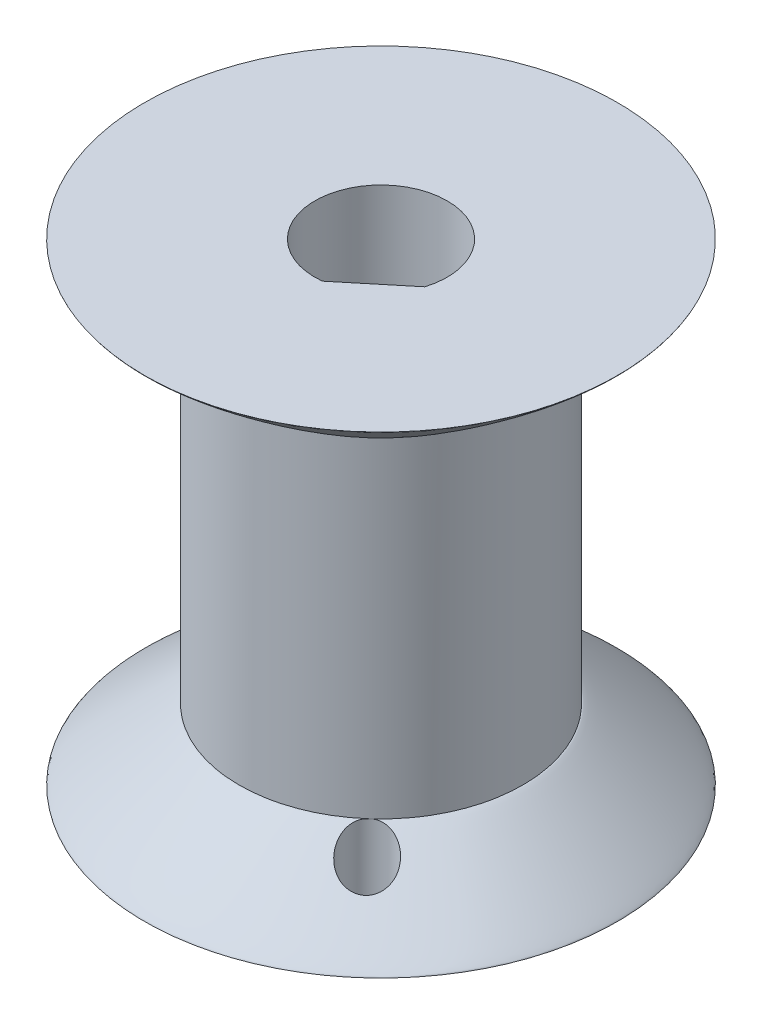
ISO-10303-21;
HEADER;
FILE_DESCRIPTION(('STEP AP214'),'2;1');
FILE_NAME('part.step','',(''),(''),'','','');
FILE_SCHEMA(('AUTOMOTIVE_DESIGN { 1 0 10303 214 1 1 1 1 }'));
ENDSEC;
DATA;
#1=APPLICATION_CONTEXT('core data for automotive mechanical design processes');
#2=APPLICATION_PROTOCOL_DEFINITION('international standard','automotive_design',2000,#1);
#3=PRODUCT_CONTEXT('',#1,'mechanical');
#4=PRODUCT('Part','Part','',(#3));
#5=PRODUCT_RELATED_PRODUCT_CATEGORY('part','',(#4));
#6=PRODUCT_DEFINITION_FORMATION('','',#4);
#7=PRODUCT_DEFINITION_CONTEXT('part definition',#1,'design');
#8=PRODUCT_DEFINITION('design','',#6,#7);
#9=PRODUCT_DEFINITION_SHAPE('','',#8);
#10=(LENGTH_UNIT() NAMED_UNIT(*) SI_UNIT(.MILLI.,.METRE.));
#11=(NAMED_UNIT(*) PLANE_ANGLE_UNIT() SI_UNIT($,.RADIAN.));
#12=(NAMED_UNIT(*) SI_UNIT($,.STERADIAN.) SOLID_ANGLE_UNIT());
#13=UNCERTAINTY_MEASURE_WITH_UNIT(LENGTH_MEASURE(1.E-05),#10,'distance_accuracy_value','');
#14=(GEOMETRIC_REPRESENTATION_CONTEXT(3) GLOBAL_UNCERTAINTY_ASSIGNED_CONTEXT((#13)) GLOBAL_UNIT_ASSIGNED_CONTEXT((#10,
#11,#12)) REPRESENTATION_CONTEXT('',''));
#15=CARTESIAN_POINT('',(0.,0.,0.));
#16=DIRECTION('',(0.,0.,1.));
#17=DIRECTION('',(1.,0.,0.));
#18=AXIS2_PLACEMENT_3D('',#15,#16,#17);
#19=CARTESIAN_POINT('',(0.,20.,0.));
#20=DIRECTION('',(0.,-1.,0.));
#21=DIRECTION('',(0.,0.,-1.));
#22=AXIS2_PLACEMENT_3D('',#19,#20,#21);
#23=CYLINDRICAL_SURFACE('',#22,6.);
#24=CARTESIAN_POINT('',(0.,3.,-6.));
#25=CARTESIAN_POINT('',(0.78539815944648,3.,-6.00000000000033));
#26=CARTESIAN_POINT('',(1.57048730980716,3.,-5.84383605849674));
#27=CARTESIAN_POINT('',(3.02171387857392,3.,-5.2427183316387));
#28=CARTESIAN_POINT('',(3.6872803226441,3.00000000000016,-4.79800105159414));
#29=CARTESIAN_POINT('',(4.79800105159447,2.99999999999984,-3.68728032264443));
#30=CARTESIAN_POINT('',(5.24271833163759,2.99999999999984,-3.02171387857378));
#31=CARTESIAN_POINT('',(5.84383605849785,3.00000000000016,-1.5704873098073));
#32=CARTESIAN_POINT('',(6.00000000000033,3.00000000000016,-0.785398159445174));
#33=CARTESIAN_POINT('',(5.99999999999967,2.99999999999984,0.785398159445173));
#34=CARTESIAN_POINT('',(5.84383605849752,3.00000000000016,1.57048730980697));
#35=CARTESIAN_POINT('',(5.24271833163792,2.99999999999984,3.02171387857411));
#36=CARTESIAN_POINT('',(4.7980010515945,3.,3.68728032264408));
#37=CARTESIAN_POINT('',(3.68728032264407,3.,4.7980010515945));
#38=CARTESIAN_POINT('',(3.0217138785739,3.,5.24271833163818));
#39=CARTESIAN_POINT('',(1.57048730980719,3.,5.84383605849725));
#40=CARTESIAN_POINT('',(0.785398159445174,3.,6.));
#41=CARTESIAN_POINT('',(-0.785398159445173,3.,6.));
#42=CARTESIAN_POINT('',(-1.57048730980685,3.00000000000033,5.84383605849726));
#43=CARTESIAN_POINT('',(-3.02171387857421,2.99999999999967,5.24271833163819));
#44=CARTESIAN_POINT('',(-3.68728032264408,3.,4.7980010515945));
#45=CARTESIAN_POINT('',(-4.7980010515945,3.,3.68728032264407));
#46=CARTESIAN_POINT('',(-5.2427183316383,2.99999999999967,3.021713878574));
#47=CARTESIAN_POINT('',(-5.84383605849714,3.00000000000033,1.57048730980709));
#48=CARTESIAN_POINT('',(-6.,3.,0.785398159445165));
#49=CARTESIAN_POINT('',(-6.,3.,-0.785398159445184));
#50=CARTESIAN_POINT('',(-5.84383605849682,3.00000000000049,-1.57048730980675));
#51=CARTESIAN_POINT('',(-5.24271833163863,2.99999999999951,-3.02171387857431));
#52=CARTESIAN_POINT('',(-4.79800105159472,2.99999999999983,-3.68728032264385));
#53=CARTESIAN_POINT('',(-3.68728032264387,3.00000000000016,-4.7980010515947));
#54=CARTESIAN_POINT('',(-3.021713878574,3.,-5.24271833163797));
#55=CARTESIAN_POINT('',(-1.57048730980709,3.,-5.84383605849747));
#56=CARTESIAN_POINT('',(-0.78539815944648,3.,-5.99999999999967));
#57=CARTESIAN_POINT('',(0.,3.,-6.));
#58=(BOUNDED_CURVE() B_SPLINE_CURVE(3,(#24,#25,#26,#27,#28,#29,#30,#31,#32,#33,#34,#35,#36,#37,
#38,#39,#40,#41,#42,#43,#44,#45,#46,#47,#48,#49,#50,#51,#52,#53,#54,#55,#56,#57),.UNSPECIFIED.,
.T.,.F.) B_SPLINE_CURVE_WITH_KNOTS((4,2,2,2,2,2,2,2,2,2,2,2,2,2,2,2,4),(0.,0.392699081698724,
0.785398163397448,1.17809724509617,1.5707963267949,1.96349540849362,2.35619449019234,
2.74889357189107,3.14159265358979,3.53429173528852,3.92699081698724,4.31968989868597,
4.71238898038469,5.10508806208341,5.49778714378214,5.89048622548086,6.28318530717959),
.UNSPECIFIED.) CURVE() GEOMETRIC_REPRESENTATION_ITEM() RATIONAL_B_SPLINE_CURVE((1.,1.,1.,1.,1.,
1.,1.,1.,1.,1.,1.,1.,1.,1.,1.,1.,1.,1.,1.,1.,1.,1.,1.,1.,1.,1.,1.,1.,1.,1.,1.,1.,1.,1.)) REPRESENTATION_ITEM(''));
#59=CARTESIAN_POINT('',(3.98397827858246,3.,4.48641475287619));
#60=VERTEX_POINT('',#59);
#61=EDGE_CURVE('E51',#60,#60,#58,.T.);
#62=ORIENTED_EDGE('',*,*,#61,.F.);
#63=EDGE_LOOP('',(#62));
#64=FACE_BOUND('',#63,.T.);
#65=CARTESIAN_POINT('',(0.,17.,6.));
#66=CARTESIAN_POINT('',(0.785398159446479,17.,6.00000000000033));
#67=CARTESIAN_POINT('',(1.57048730980716,17.,5.84383605849706));
#68=CARTESIAN_POINT('',(3.02171387857392,17.,5.24271833163838));
#69=CARTESIAN_POINT('',(3.6872803226441,17.,4.79800105159447));
#70=CARTESIAN_POINT('',(4.79800105159447,17.,3.6872803226441));
#71=CARTESIAN_POINT('',(5.24271833163824,17.,3.02171387857427));
#72=CARTESIAN_POINT('',(5.8438360584972,17.,1.57048730980681));
#73=CARTESIAN_POINT('',(6.00000000000033,17.,0.785398159445174));
#74=CARTESIAN_POINT('',(5.99999999999967,17.,-0.785398159445174));
#75=CARTESIAN_POINT('',(5.84383605849753,17.,-1.57048730980714));
#76=CARTESIAN_POINT('',(5.24271833163792,17.,-3.02171387857395));
#77=CARTESIAN_POINT('',(4.79800105159417,17.,-3.6872803226444));
#78=CARTESIAN_POINT('',(3.6872803226444,17.,-4.79800105159418));
#79=CARTESIAN_POINT('',(3.02171387857374,17.,-5.24271833163818));
#80=CARTESIAN_POINT('',(1.57048730980736,17.,-5.84383605849725));
#81=CARTESIAN_POINT('',(0.785398159445174,17.,-6.));
#82=CARTESIAN_POINT('',(-0.785398159445173,17.,-6.));
#83=CARTESIAN_POINT('',(-1.57048730980685,17.,-5.84383605849726));
#84=CARTESIAN_POINT('',(-3.02171387857421,17.,-5.24271833163819));
#85=CARTESIAN_POINT('',(-3.6872803226444,17.,-4.79800105159417));
#86=CARTESIAN_POINT('',(-4.79800105159417,17.,-3.6872803226444));
#87=CARTESIAN_POINT('',(-5.24271833163797,17.,-3.021713878574));
#88=CARTESIAN_POINT('',(-5.84383605849747,17.,-1.57048730980709));
#89=CARTESIAN_POINT('',(-6.,17.,-0.785398159445165));
#90=CARTESIAN_POINT('',(-6.,17.,0.785398159445184));
#91=CARTESIAN_POINT('',(-5.84383605849715,17.,1.57048730980675));
#92=CARTESIAN_POINT('',(-5.24271833163831,17.,3.02171387857431));
#93=CARTESIAN_POINT('',(-4.7980010515944,17.,3.6872803226445));
#94=CARTESIAN_POINT('',(-3.6872803226442,17.,4.79800105159405));
#95=CARTESIAN_POINT('',(-3.02171387857384,17.,5.24271833163764));
#96=CARTESIAN_POINT('',(-1.57048730980725,17.,5.84383605849779));
#97=CARTESIAN_POINT('',(-0.78539815944648,17.,5.99999999999967));
#98=CARTESIAN_POINT('',(0.,17.,6.));
#99=(BOUNDED_CURVE() B_SPLINE_CURVE(3,(#65,#66,#67,#68,#69,#70,#71,#72,#73,#74,#75,#76,#77,#78,
#79,#80,#81,#82,#83,#84,#85,#86,#87,#88,#89,#90,#91,#92,#93,#94,#95,#96,#97,#98),.UNSPECIFIED.,
.T.,.F.) B_SPLINE_CURVE_WITH_KNOTS((4,2,2,2,2,2,2,2,2,2,2,2,2,2,2,2,4),(0.,0.392699081698724,
0.785398163397448,1.17809724509617,1.5707963267949,1.96349540849362,2.35619449019234,
2.74889357189107,3.14159265358979,3.53429173528852,3.92699081698724,4.31968989868597,
4.71238898038469,5.10508806208341,5.49778714378214,5.89048622548086,6.28318530717959),
.UNSPECIFIED.) CURVE() GEOMETRIC_REPRESENTATION_ITEM() RATIONAL_B_SPLINE_CURVE((1.,1.,1.,1.,1.,
1.,1.,1.,1.,1.,1.,1.,1.,1.,1.,1.,1.,1.,1.,1.,1.,1.,1.,1.,1.,1.,1.,1.,1.,1.,1.,1.,1.,1.)) REPRESENTATION_ITEM(''));
#100=CARTESIAN_POINT('',(0.,17.,6.));
#101=VERTEX_POINT('',#100);
#102=EDGE_CURVE('E12',#101,#101,#99,.T.);
#103=ORIENTED_EDGE('',*,*,#102,.F.);
#104=EDGE_LOOP('',(#103));
#105=FACE_BOUND('',#104,.T.);
#106=ADVANCED_FACE('F36',(#64,#105),#23,.T.);
#107=CARTESIAN_POINT('',(0.,20.,0.));
#108=DIRECTION('',(0.,1.,0.));
#109=DIRECTION('',(0.,0.,1.));
#110=AXIS2_PLACEMENT_3D('',#107,#108,#109);
#111=PLANE('',#110);
#112=DIRECTION('',(0.771022126915851,0.,-0.636808354064359));
#113=VECTOR('',#112,1.);
#114=CARTESIAN_POINT('',(0.304561232508077,20.,2.78338686776617));
#115=LINE('',#114,#113);
#116=CARTESIAN_POINT('',(0.304561232508077,20.,2.78338686776617));
#117=VERTEX_POINT('',#116);
#118=CARTESIAN_POINT('',(2.67570186451312,20.,0.824996686200014));
#119=VERTEX_POINT('',#118);
#120=EDGE_CURVE('E73',#117,#119,#115,.T.);
#121=ORIENTED_EDGE('',*,*,#120,.F.);
#122=CARTESIAN_POINT('',(0.,20.,0.));
#123=DIRECTION('',(0.,1.,0.));
#124=DIRECTION('',(0.,0.,1.));
#125=AXIS2_PLACEMENT_3D('',#122,#123,#124);
#126=CIRCLE('',#125,2.8);
#127=EDGE_CURVE('E80',#119,#117,#126,.T.);
#128=ORIENTED_EDGE('',*,*,#127,.F.);
#129=EDGE_LOOP('',(#121,#128));
#130=FACE_BOUND('',#129,.T.);
#131=CARTESIAN_POINT('',(0.,20.,10.));
#132=CARTESIAN_POINT('',(-1.3089969324108,20.,9.99999999999935));
#133=CARTESIAN_POINT('',(-2.61747884967859,20.,9.73972676416179));
#134=CARTESIAN_POINT('',(-5.03618979762323,20.,8.73786388606394));
#135=CARTESIAN_POINT('',(-6.14546720440743,20.,7.99666841932319));
#136=CARTESIAN_POINT('',(-7.99666841932356,20.,6.14546720440772));
#137=CARTESIAN_POINT('',(-8.73786388606329,20.,5.03618979762353));
#138=CARTESIAN_POINT('',(-9.73972676416245,20.,2.61747884967824));
#139=CARTESIAN_POINT('',(-10.0000000000007,20.,1.30899693240864));
#140=CARTESIAN_POINT('',(-9.99999999999935,20.,-1.30899693240861));
#141=CARTESIAN_POINT('',(-9.73972676416179,20.,-2.61747884967826));
#142=CARTESIAN_POINT('',(-8.73786388606394,20.,-5.03618979762356));
#143=CARTESIAN_POINT('',(-7.99666841932362,20.,-6.14546720440733));
#144=CARTESIAN_POINT('',(-6.14546720440734,20.,-7.99666841932361));
#145=CARTESIAN_POINT('',(-5.03618979762352,20.,-8.73786388606267));
#146=CARTESIAN_POINT('',(-2.61747884967825,20.,-9.73972676416308));
#147=CARTESIAN_POINT('',(-1.30899693240862,20.,-10.));
#148=CARTESIAN_POINT('',(1.30899693240862,20.,-10.));
#149=CARTESIAN_POINT('',(2.61747884967958,20.,-9.73972676416307));
#150=CARTESIAN_POINT('',(5.03618979762224,20.,-8.73786388606266));
#151=CARTESIAN_POINT('',(6.14546720440732,20.,-7.99666841932362));
#152=CARTESIAN_POINT('',(7.99666841932361,20.,-6.14546720440734));
#153=CARTESIAN_POINT('',(8.73786388606265,20.,-5.03618979762297));
#154=CARTESIAN_POINT('',(9.73972676416308,20.,-2.61747884967883));
#155=CARTESIAN_POINT('',(9.99999999999869,20.,-1.30899693240862));
#156=CARTESIAN_POINT('',(10.0000000000013,20.,1.30899693240862));
#157=CARTESIAN_POINT('',(9.73972676416244,20.,2.61747884967752));
#158=CARTESIAN_POINT('',(8.73786388606331,20.,5.03618979762427));
#159=CARTESIAN_POINT('',(7.99666841932401,20.,6.14546720440629));
#160=CARTESIAN_POINT('',(6.14546720440694,20.,7.99666841932466));
#161=CARTESIAN_POINT('',(5.03618979762325,20.,8.73786388606364));
#162=CARTESIAN_POINT('',(2.61747884967855,20.,9.7397267641621));
#163=CARTESIAN_POINT('',(1.3089969324108,20.,10.0000000000007));
#164=CARTESIAN_POINT('',(0.,20.,10.));
#165=(BOUNDED_CURVE() B_SPLINE_CURVE(3,(#131,#132,#133,#134,#135,#136,#137,#138,#139,#140,#141,
#142,#143,#144,#145,#146,#147,#148,#149,#150,#151,#152,#153,#154,#155,#156,#157,#158,#159,#160,
#161,#162,#163,#164),.UNSPECIFIED.,.T.,.F.) B_SPLINE_CURVE_WITH_KNOTS((4,2,2,2,2,2,2,2,2,2,2,2,
2,2,2,2,4),(0.,0.392699081698725,0.785398163397448,1.17809724509617,1.5707963267949,
1.96349540849362,2.35619449019234,2.74889357189107,3.14159265358979,3.53429173528852,
3.92699081698724,4.31968989868597,4.71238898038469,5.10508806208341,5.49778714378214,
5.89048622548086,6.28318530717959),
.UNSPECIFIED.) CURVE() GEOMETRIC_REPRESENTATION_ITEM() RATIONAL_B_SPLINE_CURVE((1.,1.,1.,1.,1.,
1.,1.,1.,1.,1.,1.,1.,1.,1.,1.,1.,1.,1.,1.,1.,1.,1.,1.,1.,1.,1.,1.,1.,1.,1.,1.,1.,1.,1.)) REPRESENTATION_ITEM(''));
#166=CARTESIAN_POINT('',(0.,20.,10.));
#167=VERTEX_POINT('',#166);
#168=EDGE_CURVE('E102',#167,#167,#165,.F.);
#169=ORIENTED_EDGE('',*,*,#168,.T.);
#170=EDGE_LOOP('',(#169));
#171=FACE_BOUND('',#170,.T.);
#172=ADVANCED_FACE('F87',(#130,#171),#111,.T.);
#173=CARTESIAN_POINT('',(0.,0.,0.));
#174=DIRECTION('',(0.,1.,0.));
#175=DIRECTION('',(0.,0.,1.));
#176=AXIS2_PLACEMENT_3D('',#173,#174,#175);
#177=PLANE('',#176);
#178=CARTESIAN_POINT('',(4.64780682415171,0.,5.23429954486451));
#179=DIRECTION('',(0.,-1.,0.));
#180=DIRECTION('',(0.,0.,-1.));
#181=AXIS2_PLACEMENT_3D('',#178,#179,#180);
#182=CIRCLE('',#181,1.);
#183=CARTESIAN_POINT('',(4.64780682415171,0.,4.23429954486451));
#184=VERTEX_POINT('',#183);
#185=EDGE_CURVE('E206',#184,#184,#182,.T.);
#186=ORIENTED_EDGE('',*,*,#185,.F.);
#187=EDGE_LOOP('',(#186));
#188=FACE_BOUND('',#187,.T.);
#189=CARTESIAN_POINT('',(0.,0.,0.));
#190=DIRECTION('',(0.,1.,0.));
#191=DIRECTION('',(0.,0.,1.));
#192=AXIS2_PLACEMENT_3D('',#189,#190,#191);
#193=CIRCLE('',#192,2.8);
#194=CARTESIAN_POINT('',(2.67570186451312,0.,0.824996686200014));
#195=VERTEX_POINT('',#194);
#196=CARTESIAN_POINT('',(0.304561232508077,0.,2.78338686776617));
#197=VERTEX_POINT('',#196);
#198=EDGE_CURVE('E85',#195,#197,#193,.T.);
#199=ORIENTED_EDGE('',*,*,#198,.T.);
#200=DIRECTION('',(0.771022126915851,0.,-0.636808354064359));
#201=VECTOR('',#200,1.);
#202=CARTESIAN_POINT('',(0.304561232508077,0.,2.78338686776617));
#203=LINE('',#202,#201);
#204=EDGE_CURVE('E89',#197,#195,#203,.T.);
#205=ORIENTED_EDGE('',*,*,#204,.T.);
#206=EDGE_LOOP('',(#199,#205));
#207=FACE_BOUND('',#206,.T.);
#208=CARTESIAN_POINT('',(0.,0.,-10.));
#209=CARTESIAN_POINT('',(-1.3089969324108,-3.26920984742228E-13,-9.99999999999934));
#210=CARTESIAN_POINT('',(-2.61747884967843,0.,-9.73972676416179));
#211=CARTESIAN_POINT('',(-5.03618979762339,0.,-8.73786388606394));
#212=CARTESIAN_POINT('',(-6.14546720440678,-1.63135231719055E-13,-7.99666841932384));
#213=CARTESIAN_POINT('',(-7.99666841932421,1.63568912588049E-13,-6.14546720440706));
#214=CARTESIAN_POINT('',(-8.73786388606395,0.,-5.03618979762369));
#215=CARTESIAN_POINT('',(-9.7397267641618,0.,-2.61747884967807));
#216=CARTESIAN_POINT('',(-10.,0.,-1.30899693240864));
#217=CARTESIAN_POINT('',(-10.,0.,1.30899693240861));
#218=CARTESIAN_POINT('',(-9.73972676416244,0.,2.61747884967843));
#219=CARTESIAN_POINT('',(-8.73786388606328,0.,5.03618979762339));
#220=CARTESIAN_POINT('',(-7.9966684193246,0.,6.145467204407));
#221=CARTESIAN_POINT('',(-6.14546720440636,0.,7.99666841932394));
#222=CARTESIAN_POINT('',(-5.03618979762319,-2.45461789099949E-13,8.73786388606267));
#223=CARTESIAN_POINT('',(-2.61747884967858,2.44594427361961E-13,9.73972676416308));
#224=CARTESIAN_POINT('',(-1.30899693240862,0.,10.));
#225=CARTESIAN_POINT('',(1.30899693240862,0.,10.));
#226=CARTESIAN_POINT('',(2.61747884967893,0.,9.73972676416307));
#227=CARTESIAN_POINT('',(5.03618979762289,0.,8.73786388606266));
#228=CARTESIAN_POINT('',(6.145467204407,0.,7.9966684193246));
#229=CARTESIAN_POINT('',(7.99666841932394,0.,6.14546720440636));
#230=CARTESIAN_POINT('',(8.73786388606265,1.63135231719264E-13,5.03618979762362));
#231=CARTESIAN_POINT('',(9.73972676416308,-1.63568912588258E-13,2.61747884967818));
#232=CARTESIAN_POINT('',(9.99999999999934,-2.45244948665139E-13,1.30899693240862));
#233=CARTESIAN_POINT('',(10.0000000000007,2.44811267796145E-13,-1.30899693240862));
#234=CARTESIAN_POINT('',(9.73972676416178,-5.71732252538164E-13,-2.61747884967817));
#235=CARTESIAN_POINT('',(8.73786388606396,5.71732252538164E-13,-5.03618979762362));
#236=CARTESIAN_POINT('',(7.99666841932401,-2.45028108230799E-13,-6.14546720440694));
#237=CARTESIAN_POINT('',(6.14546720440694,2.45028108230799E-13,-7.99666841932401));
#238=CARTESIAN_POINT('',(5.03618979762309,1.63352072153866E-13,-8.73786388606364));
#239=CARTESIAN_POINT('',(2.61747884967871,-1.63352072153866E-13,-9.7397267641621));
#240=CARTESIAN_POINT('',(1.3089969324108,3.26487303873234E-13,-10.0000000000007));
#241=CARTESIAN_POINT('',(0.,0.,-10.));
#242=(BOUNDED_CURVE() B_SPLINE_CURVE(3,(#208,#209,#210,#211,#212,#213,#214,#215,#216,#217,#218,
#219,#220,#221,#222,#223,#224,#225,#226,#227,#228,#229,#230,#231,#232,#233,#234,#235,#236,#237,
#238,#239,#240,#241),.UNSPECIFIED.,.T.,.F.) B_SPLINE_CURVE_WITH_KNOTS((4,2,2,2,2,2,2,2,2,2,2,2,
2,2,2,2,4),(0.,0.392699081698725,0.785398163397448,1.17809724509617,1.5707963267949,
1.96349540849362,2.35619449019234,2.74889357189107,3.14159265358979,3.53429173528852,
3.92699081698724,4.31968989868597,4.71238898038469,5.10508806208341,5.49778714378214,
5.89048622548086,6.28318530717959),
.UNSPECIFIED.) CURVE() GEOMETRIC_REPRESENTATION_ITEM() RATIONAL_B_SPLINE_CURVE((1.,1.,1.,1.,1.,
1.,1.,1.,1.,1.,1.,1.,1.,1.,1.,1.,1.,1.,1.,1.,1.,1.,1.,1.,1.,1.,1.,1.,1.,1.,1.,1.,1.,1.)) REPRESENTATION_ITEM(''));
#243=CARTESIAN_POINT('',(0.,0.,-10.));
#244=VERTEX_POINT('',#243);
#245=EDGE_CURVE('E95',#244,#244,#242,.F.);
#246=ORIENTED_EDGE('',*,*,#245,.T.);
#247=EDGE_LOOP('',(#246));
#248=FACE_BOUND('',#247,.T.);
#249=ADVANCED_FACE('F150',(#188,#207,#248),#177,.F.);
#250=CARTESIAN_POINT('',(0.,20.,0.));
#251=DIRECTION('',(0.,-1.,0.));
#252=DIRECTION('',(0.,0.,-1.));
#253=AXIS2_PLACEMENT_3D('',#250,#251,#252);
#254=CYLINDRICAL_SURFACE('',#253,2.8);
#255=ORIENTED_EDGE('',*,*,#198,.F.);
#256=DIRECTION('',(0.,-1.,0.));
#257=VECTOR('',#256,1.);
#258=CARTESIAN_POINT('',(2.67570186451312,20.,0.824996686200014));
#259=LINE('',#258,#257);
#260=EDGE_CURVE('E76',#119,#195,#259,.T.);
#261=ORIENTED_EDGE('',*,*,#260,.F.);
#262=ORIENTED_EDGE('',*,*,#127,.T.);
#263=DIRECTION('',(0.,-1.,0.));
#264=VECTOR('',#263,1.);
#265=CARTESIAN_POINT('',(0.304561232508077,20.,2.78338686776617));
#266=LINE('',#265,#264);
#267=EDGE_CURVE('E63',#117,#197,#266,.T.);
#268=ORIENTED_EDGE('',*,*,#267,.T.);
#269=EDGE_LOOP('',(#255,#261,#262,#268));
#270=FACE_BOUND('',#269,.T.);
#271=ADVANCED_FACE('F83',(#270),#254,.F.);
#272=CARTESIAN_POINT('',(0.304561232508077,20.,2.78338686776617));
#273=DIRECTION('',(-0.636808354064359,0.,-0.771022126915851));
#274=DIRECTION('',(-0.771022126915851,0.,0.636808354064359));
#275=AXIS2_PLACEMENT_3D('',#272,#273,#274);
#276=PLANE('',#275);
#277=ORIENTED_EDGE('',*,*,#204,.F.);
#278=ORIENTED_EDGE('',*,*,#267,.F.);
#279=ORIENTED_EDGE('',*,*,#120,.T.);
#280=ORIENTED_EDGE('',*,*,#260,.T.);
#281=EDGE_LOOP('',(#277,#278,#279,#280));
#282=FACE_BOUND('',#281,.T.);
#283=ADVANCED_FACE('F75',(#282),#276,.T.);
#284=CARTESIAN_POINT('',(0.,20.,10.));
#285=CARTESIAN_POINT('',(1.3089969324108,20.,10.0000000000007));
#286=CARTESIAN_POINT('',(2.61747884967855,20.,9.7397267641621));
#287=CARTESIAN_POINT('',(5.03618979762325,20.,8.73786388606364));
#288=CARTESIAN_POINT('',(6.14546720440694,20.,7.99666841932466));
#289=CARTESIAN_POINT('',(7.99666841932401,20.,6.14546720440629));
#290=CARTESIAN_POINT('',(8.73786388606331,20.,5.03618979762427));
#291=CARTESIAN_POINT('',(9.73972676416244,20.,2.61747884967752));
#292=CARTESIAN_POINT('',(10.0000000000013,20.,1.30899693240862));
#293=CARTESIAN_POINT('',(9.99999999999869,20.,-1.30899693240862));
#294=CARTESIAN_POINT('',(9.73972676416308,20.,-2.61747884967883));
#295=CARTESIAN_POINT('',(8.73786388606265,20.,-5.03618979762297));
#296=CARTESIAN_POINT('',(7.99666841932361,20.,-6.14546720440734));
#297=CARTESIAN_POINT('',(6.14546720440732,20.,-7.99666841932362));
#298=CARTESIAN_POINT('',(5.03618979762224,20.,-8.73786388606266));
#299=CARTESIAN_POINT('',(2.61747884967958,20.,-9.73972676416307));
#300=CARTESIAN_POINT('',(1.30899693240862,20.,-10.));
#301=CARTESIAN_POINT('',(-1.30899693240862,20.,-10.));
#302=CARTESIAN_POINT('',(-2.61747884967825,20.,-9.73972676416308));
#303=CARTESIAN_POINT('',(-5.03618979762352,20.,-8.73786388606267));
#304=CARTESIAN_POINT('',(-6.14546720440734,20.,-7.99666841932361));
#305=CARTESIAN_POINT('',(-7.99666841932362,20.,-6.14546720440733));
#306=CARTESIAN_POINT('',(-8.73786388606394,20.,-5.03618979762356));
#307=CARTESIAN_POINT('',(-9.73972676416179,20.,-2.61747884967826));
#308=CARTESIAN_POINT('',(-9.99999999999935,20.,-1.30899693240861));
#309=CARTESIAN_POINT('',(-10.0000000000007,20.,1.30899693240864));
#310=CARTESIAN_POINT('',(-9.73972676416245,20.,2.61747884967824));
#311=CARTESIAN_POINT('',(-8.73786388606329,20.,5.03618979762353));
#312=CARTESIAN_POINT('',(-7.99666841932356,20.,6.14546720440772));
#313=CARTESIAN_POINT('',(-6.14546720440743,20.,7.99666841932319));
#314=CARTESIAN_POINT('',(-5.03618979762323,20.,8.73786388606394));
#315=CARTESIAN_POINT('',(-2.61747884967859,20.,9.73972676416179));
#316=CARTESIAN_POINT('',(-1.3089969324108,20.,9.99999999999935));
#317=CARTESIAN_POINT('',(0.,20.,10.));
#318=CARTESIAN_POINT('',(0.,17.1636937904379,9.00222965717159));
#319=CARTESIAN_POINT('',(1.17838910060951,17.1636937904379,9.00222965717225));
#320=CARTESIAN_POINT('',(2.35631457275959,17.1636937904379,8.76792571290804));
#321=CARTESIAN_POINT('',(4.53369371553087,17.1636937904379,7.86602574154581));
#322=CARTESIAN_POINT('',(5.53229071246915,17.1636937904379,7.19878456030119));
#323=CARTESIAN_POINT('',(7.19878456030021,17.1636937904379,5.53229071246817));
#324=CARTESIAN_POINT('',(7.86602574154545,17.1636937904379,4.5336937155318));
#325=CARTESIAN_POINT('',(8.76792571290841,17.1636937904379,2.35631457275865));
#326=CARTESIAN_POINT('',(9.0022296571729,17.1636937904379,1.17838910060755));
#327=CARTESIAN_POINT('',(9.00222965717029,17.1636937904379,-1.17838910060755));
#328=CARTESIAN_POINT('',(8.76792571291037,17.1636937904392,-2.35631457276013));
#329=CARTESIAN_POINT('',(7.86602574154349,17.1636937904366,-4.53369371553034));
#330=CARTESIAN_POINT('',(7.19878456030041,17.1636937904379,-5.53229071246927));
#331=CARTESIAN_POINT('',(5.53229071246894,17.1636937904379,-7.1987845603001));
#332=CARTESIAN_POINT('',(4.53369371552978,17.1636937904405,-7.86602574154357));
#333=CARTESIAN_POINT('',(2.35631457276071,17.1636937904353,-8.76792571291029));
#334=CARTESIAN_POINT('',(1.17838910060755,17.1636937904379,-9.00222965717159));
#335=CARTESIAN_POINT('',(-1.17838910060755,17.1636937904379,-9.00222965717159));
#336=CARTESIAN_POINT('',(-2.35631457275954,17.1636937904379,-8.76792571290964));
#337=CARTESIAN_POINT('',(-4.5336937155309,17.1636937904379,-7.86602574154423));
#338=CARTESIAN_POINT('',(-5.53229071246927,17.1636937904379,-7.19878456030041));
#339=CARTESIAN_POINT('',(-7.1987845603001,17.1636937904379,-5.53229071246894));
#340=CARTESIAN_POINT('',(-7.86602574154537,17.1636937904379,-4.53369371553108));
#341=CARTESIAN_POINT('',(-8.76792571290848,17.1636937904379,-2.35631457275941));
#342=CARTESIAN_POINT('',(-9.00222965716963,17.1636937904366,-1.17838910060754));
#343=CARTESIAN_POINT('',(-9.00222965717355,17.1636937904392,1.17838910060757));
#344=CARTESIAN_POINT('',(-8.76792571290915,17.1636937904379,2.35631457275922));
#345=CARTESIAN_POINT('',(-7.86602574154473,17.1636937904379,4.53369371553122));
#346=CARTESIAN_POINT('',(-7.19878456029994,17.1636937904379,5.5322907124691));
#347=CARTESIAN_POINT('',(-5.53229071246946,17.1636937904379,7.19878456030023));
#348=CARTESIAN_POINT('',(-4.53369371553092,17.1636937904366,7.86602574154537));
#349=CARTESIAN_POINT('',(-2.35631457275957,17.1636937904392,8.76792571290848));
#350=CARTESIAN_POINT('',(-1.17838910060951,17.1636937904379,9.00222965717094));
#351=CARTESIAN_POINT('',(0.,17.1636937904379,9.00222965717159));
#352=CARTESIAN_POINT('',(0.,17.,6.));
#353=CARTESIAN_POINT('',(0.785398159446479,17.,6.00000000000033));
#354=CARTESIAN_POINT('',(1.57048730980716,17.,5.84383605849706));
#355=CARTESIAN_POINT('',(3.02171387857392,17.,5.24271833163838));
#356=CARTESIAN_POINT('',(3.6872803226441,17.,4.79800105159447));
#357=CARTESIAN_POINT('',(4.79800105159447,17.,3.6872803226441));
#358=CARTESIAN_POINT('',(5.24271833163824,17.,3.02171387857427));
#359=CARTESIAN_POINT('',(5.8438360584972,17.,1.57048730980681));
#360=CARTESIAN_POINT('',(6.00000000000033,17.,0.785398159445174));
#361=CARTESIAN_POINT('',(5.99999999999967,17.,-0.785398159445174));
#362=CARTESIAN_POINT('',(5.84383605849753,17.,-1.57048730980714));
#363=CARTESIAN_POINT('',(5.24271833163792,17.,-3.02171387857395));
#364=CARTESIAN_POINT('',(4.79800105159417,17.,-3.6872803226444));
#365=CARTESIAN_POINT('',(3.6872803226444,17.,-4.79800105159418));
#366=CARTESIAN_POINT('',(3.02171387857374,17.,-5.24271833163818));
#367=CARTESIAN_POINT('',(1.57048730980736,17.,-5.84383605849725));
#368=CARTESIAN_POINT('',(0.785398159445174,17.,-6.));
#369=CARTESIAN_POINT('',(-0.785398159445173,17.,-6.));
#370=CARTESIAN_POINT('',(-1.57048730980685,17.,-5.84383605849726));
#371=CARTESIAN_POINT('',(-3.02171387857421,17.,-5.24271833163819));
#372=CARTESIAN_POINT('',(-3.6872803226444,17.,-4.79800105159417));
#373=CARTESIAN_POINT('',(-4.79800105159417,17.,-3.6872803226444));
#374=CARTESIAN_POINT('',(-5.24271833163797,17.,-3.021713878574));
#375=CARTESIAN_POINT('',(-5.84383605849747,17.,-1.57048730980709));
#376=CARTESIAN_POINT('',(-6.,17.,-0.785398159445165));
#377=CARTESIAN_POINT('',(-6.,17.,0.785398159445184));
#378=CARTESIAN_POINT('',(-5.84383605849715,17.,1.57048730980675));
#379=CARTESIAN_POINT('',(-5.24271833163831,17.,3.02171387857431));
#380=CARTESIAN_POINT('',(-4.7980010515944,17.,3.6872803226445));
#381=CARTESIAN_POINT('',(-3.6872803226442,17.,4.79800105159405));
#382=CARTESIAN_POINT('',(-3.02171387857384,17.,5.24271833163764));
#383=CARTESIAN_POINT('',(-1.57048730980725,17.,5.84383605849779));
#384=CARTESIAN_POINT('',(-0.78539815944648,17.,5.99999999999967));
#385=CARTESIAN_POINT('',(0.,17.,6.));
#386=(BOUNDED_SURFACE() B_SPLINE_SURFACE(2,3,((#284,#285,#286,#287,#288,#289,#290,#291,#292,
#293,#294,#295,#296,#297,#298,#299,#300,#301,#302,#303,#304,#305,#306,#307,#308,#309,#310,#311,
#312,#313,#314,#315,#316,#317),(#318,#319,#320,#321,#322,#323,#324,#325,#326,#327,#328,#329,
#330,#331,#332,#333,#334,#335,#336,#337,#338,#339,#340,#341,#342,#343,#344,#345,#346,#347,#348,
#349,#350,#351),(#352,#353,#354,#355,#356,#357,#358,#359,#360,#361,#362,#363,#364,#365,#366,
#367,#368,#369,#370,#371,#372,#373,#374,#375,#376,#377,#378,#379,#380,#381,#382,#383,#384,
#385)),.UNSPECIFIED.,.F.,.T.,.F.) B_SPLINE_SURFACE_WITH_KNOTS((3,3),(4,2,2,2,2,2,2,2,2,2,2,2,2,
2,2,2,4),(0.,1.),(0.,0.392699081698724,0.785398163397448,1.17809724509617,1.5707963267949,
1.96349540849362,2.35619449019234,2.74889357189107,3.14159265358979,3.53429173528852,
3.92699081698724,4.31968989868597,4.71238898038469,5.10508806208341,5.49778714378214,
5.89048622548086,6.28318530717959),
.UNSPECIFIED.) GEOMETRIC_REPRESENTATION_ITEM() RATIONAL_B_SPLINE_SURFACE(((1.,1.,1.,1.,1.,1.,1.,
1.,1.,1.,1.,1.,1.,1.,1.,1.,1.,1.,1.,1.,1.,1.,1.,1.,1.,1.,1.,1.,1.,1.,1.,1.,1.,1.),
(0.0526315789473684,0.0526315789473684,0.0526315789473684,0.0526315789473684,0.0526315789473684,
0.0526315789473684,0.0526315789473684,0.0526315789473684,0.0526315789473684,0.0526315789473684,
0.0526315789473684,0.0526315789473684,0.0526315789473684,0.0526315789473684,0.0526315789473684,
0.0526315789473684,0.0526315789473684,0.0526315789473684,0.0526315789473684,0.0526315789473684,
0.0526315789473684,0.0526315789473684,0.0526315789473684,0.0526315789473684,0.0526315789473684,
0.0526315789473684,0.0526315789473684,0.0526315789473684,0.0526315789473684,0.0526315789473684,
0.0526315789473684,0.0526315789473684,0.0526315789473684,0.0526315789473684),(1.,1.,1.,1.,1.,1.,
1.,1.,1.,1.,1.,1.,1.,1.,1.,1.,1.,1.,1.,1.,1.,1.,1.,1.,1.,1.,1.,1.,1.,1.,1.,1.,1.,1.))) REPRESENTATION_ITEM('') SURFACE());
#387=ORIENTED_EDGE('',*,*,#102,.T.);
#388=EDGE_LOOP('',(#387));
#389=FACE_BOUND('',#388,.T.);
#390=ORIENTED_EDGE('',*,*,#168,.F.);
#391=EDGE_LOOP('',(#390));
#392=FACE_BOUND('',#391,.T.);
#393=ADVANCED_FACE('F107',(#389,#392),#386,.T.);
#394=CARTESIAN_POINT('',(0.,0.,-10.));
#395=CARTESIAN_POINT('',(1.3089969324108,3.26487303873234E-13,-10.0000000000007));
#396=CARTESIAN_POINT('',(2.61747884967871,-1.63352072153866E-13,-9.7397267641621));
#397=CARTESIAN_POINT('',(5.03618979762309,1.63352072153866E-13,-8.73786388606364));
#398=CARTESIAN_POINT('',(6.14546720440694,2.45028108230799E-13,-7.99666841932401));
#399=CARTESIAN_POINT('',(7.99666841932401,-2.45028108230799E-13,-6.14546720440694));
#400=CARTESIAN_POINT('',(8.73786388606396,5.71732252538164E-13,-5.03618979762362));
#401=CARTESIAN_POINT('',(9.73972676416178,-5.71732252538164E-13,-2.61747884967817));
#402=CARTESIAN_POINT('',(10.0000000000007,2.44811267796145E-13,-1.30899693240862));
#403=CARTESIAN_POINT('',(9.99999999999934,-2.45244948665139E-13,1.30899693240862));
#404=CARTESIAN_POINT('',(9.73972676416308,-1.63568912588258E-13,2.61747884967818));
#405=CARTESIAN_POINT('',(8.73786388606265,1.63135231719264E-13,5.03618979762362));
#406=CARTESIAN_POINT('',(7.99666841932394,0.,6.14546720440636));
#407=CARTESIAN_POINT('',(6.145467204407,0.,7.9966684193246));
#408=CARTESIAN_POINT('',(5.03618979762289,0.,8.73786388606266));
#409=CARTESIAN_POINT('',(2.61747884967893,0.,9.73972676416307));
#410=CARTESIAN_POINT('',(1.30899693240862,0.,10.));
#411=CARTESIAN_POINT('',(-1.30899693240862,0.,10.));
#412=CARTESIAN_POINT('',(-2.61747884967858,2.44594427361961E-13,9.73972676416308));
#413=CARTESIAN_POINT('',(-5.03618979762319,-2.45461789099949E-13,8.73786388606267));
#414=CARTESIAN_POINT('',(-6.14546720440636,0.,7.99666841932394));
#415=CARTESIAN_POINT('',(-7.9966684193246,0.,6.145467204407));
#416=CARTESIAN_POINT('',(-8.73786388606328,0.,5.03618979762339));
#417=CARTESIAN_POINT('',(-9.73972676416244,0.,2.61747884967843));
#418=CARTESIAN_POINT('',(-10.,0.,1.30899693240861));
#419=CARTESIAN_POINT('',(-10.,0.,-1.30899693240864));
#420=CARTESIAN_POINT('',(-9.7397267641618,0.,-2.61747884967807));
#421=CARTESIAN_POINT('',(-8.73786388606395,0.,-5.03618979762369));
#422=CARTESIAN_POINT('',(-7.99666841932421,1.63568912588049E-13,-6.14546720440706));
#423=CARTESIAN_POINT('',(-6.14546720440678,-1.63135231719055E-13,-7.99666841932384));
#424=CARTESIAN_POINT('',(-5.03618979762339,0.,-8.73786388606394));
#425=CARTESIAN_POINT('',(-2.61747884967843,0.,-9.73972676416179));
#426=CARTESIAN_POINT('',(-1.3089969324108,-3.26920984742228E-13,-9.99999999999934));
#427=CARTESIAN_POINT('',(0.,0.,-10.));
#428=CARTESIAN_POINT('',(0.,2.83630620956212,-9.00222965717159));
#429=CARTESIAN_POINT('',(1.17838910060951,2.83630620956278,-9.00222965717224));
#430=CARTESIAN_POINT('',(2.3563145727596,2.83630620956212,-8.76792571290804));
#431=CARTESIAN_POINT('',(4.53369371553087,2.83630620956212,-7.86602574154581));
#432=CARTESIAN_POINT('',(5.53229071246882,2.83630620956245,-7.19878456030021));
#433=CARTESIAN_POINT('',(7.19878456030054,2.83630620956179,-5.53229071246915));
#434=CARTESIAN_POINT('',(7.86602574154545,2.8363062095631,-4.53369371553115));
#435=CARTESIAN_POINT('',(8.76792571290841,2.83630620956114,-2.35631457275931));
#436=CARTESIAN_POINT('',(9.00222965717224,2.83630620956261,-1.17838910060756));
#437=CARTESIAN_POINT('',(9.00222965717094,2.83630620956163,1.17838910060755));
#438=CARTESIAN_POINT('',(8.76792571290971,2.83630620956278,2.35631457275931));
#439=CARTESIAN_POINT('',(7.86602574154414,2.83630620956147,4.53369371553115));
#440=CARTESIAN_POINT('',(7.19878456030041,2.83630620956212,5.53229071246797));
#441=CARTESIAN_POINT('',(5.53229071246894,2.83630620956212,7.19878456030141));
#442=CARTESIAN_POINT('',(4.53369371553059,2.83630620956081,7.86602574154487));
#443=CARTESIAN_POINT('',(2.35631457275989,2.83630620956343,8.76792571290898));
#444=CARTESIAN_POINT('',(1.17838910060755,2.83630620956212,9.00222965717159));
#445=CARTESIAN_POINT('',(-1.17838910060755,2.83630620956212,9.00222965717159));
#446=CARTESIAN_POINT('',(-2.35631457275938,2.8363062095631,8.76792571290964));
#447=CARTESIAN_POINT('',(-4.53369371553106,2.83630620956114,7.86602574154423));
#448=CARTESIAN_POINT('',(-5.53229071246797,2.83630620956212,7.19878456030042));
#449=CARTESIAN_POINT('',(-7.19878456030141,2.83630620956212,5.53229071246894));
#450=CARTESIAN_POINT('',(-7.86602574154472,2.8363062095613,4.53369371553124));
#451=CARTESIAN_POINT('',(-8.76792571290914,2.83630620956294,2.35631457275924));
#452=CARTESIAN_POINT('',(-9.00222965717159,2.83630620956196,1.17838910060754));
#453=CARTESIAN_POINT('',(-9.00222965717159,2.83630620956229,-1.17838910060757));
#454=CARTESIAN_POINT('',(-8.76792571290784,2.83630620956245,-2.35631457275905));
#455=CARTESIAN_POINT('',(-7.86602574154603,2.8363062095618,-4.53369371553138));
#456=CARTESIAN_POINT('',(-7.19878456030092,2.83630620956179,-5.53229071246877));
#457=CARTESIAN_POINT('',(-5.53229071246848,2.83630620956245,-7.19878456030056));
#458=CARTESIAN_POINT('',(-4.53369371553124,2.83630620956212,-7.86602574154472));
#459=CARTESIAN_POINT('',(-2.35631457275924,2.83630620956212,-8.76792571290914));
#460=CARTESIAN_POINT('',(-1.17838910060951,2.83630620956147,-9.00222965717094));
#461=CARTESIAN_POINT('',(0.,2.83630620956212,-9.00222965717159));
#462=CARTESIAN_POINT('',(0.,3.,-6.));
#463=CARTESIAN_POINT('',(0.78539815944648,3.,-6.00000000000033));
#464=CARTESIAN_POINT('',(1.57048730980716,3.,-5.84383605849674));
#465=CARTESIAN_POINT('',(3.02171387857392,3.,-5.2427183316387));
#466=CARTESIAN_POINT('',(3.6872803226441,3.00000000000016,-4.79800105159414));
#467=CARTESIAN_POINT('',(4.79800105159447,2.99999999999984,-3.68728032264443));
#468=CARTESIAN_POINT('',(5.24271833163759,2.99999999999984,-3.02171387857378));
#469=CARTESIAN_POINT('',(5.84383605849785,3.00000000000016,-1.5704873098073));
#470=CARTESIAN_POINT('',(6.00000000000033,3.00000000000016,-0.785398159445174));
#471=CARTESIAN_POINT('',(5.99999999999967,2.99999999999984,0.785398159445173));
#472=CARTESIAN_POINT('',(5.84383605849752,3.00000000000016,1.57048730980697));
#473=CARTESIAN_POINT('',(5.24271833163792,2.99999999999984,3.02171387857411));
#474=CARTESIAN_POINT('',(4.7980010515945,3.,3.68728032264408));
#475=CARTESIAN_POINT('',(3.68728032264407,3.,4.7980010515945));
#476=CARTESIAN_POINT('',(3.0217138785739,3.,5.24271833163818));
#477=CARTESIAN_POINT('',(1.57048730980719,3.,5.84383605849725));
#478=CARTESIAN_POINT('',(0.785398159445174,3.,6.));
#479=CARTESIAN_POINT('',(-0.785398159445173,3.,6.));
#480=CARTESIAN_POINT('',(-1.57048730980685,3.00000000000033,5.84383605849726));
#481=CARTESIAN_POINT('',(-3.02171387857421,2.99999999999967,5.24271833163819));
#482=CARTESIAN_POINT('',(-3.68728032264408,3.,4.7980010515945));
#483=CARTESIAN_POINT('',(-4.7980010515945,3.,3.68728032264407));
#484=CARTESIAN_POINT('',(-5.2427183316383,2.99999999999967,3.021713878574));
#485=CARTESIAN_POINT('',(-5.84383605849714,3.00000000000033,1.57048730980709));
#486=CARTESIAN_POINT('',(-6.,3.,0.785398159445165));
#487=CARTESIAN_POINT('',(-6.,3.,-0.785398159445184));
#488=CARTESIAN_POINT('',(-5.84383605849682,3.00000000000049,-1.57048730980675));
#489=CARTESIAN_POINT('',(-5.24271833163863,2.99999999999951,-3.02171387857431));
#490=CARTESIAN_POINT('',(-4.79800105159472,2.99999999999983,-3.68728032264385));
#491=CARTESIAN_POINT('',(-3.68728032264387,3.00000000000016,-4.7980010515947));
#492=CARTESIAN_POINT('',(-3.021713878574,3.,-5.24271833163797));
#493=CARTESIAN_POINT('',(-1.57048730980709,3.,-5.84383605849747));
#494=CARTESIAN_POINT('',(-0.78539815944648,3.,-5.99999999999967));
#495=CARTESIAN_POINT('',(0.,3.,-6.));
#496=(BOUNDED_SURFACE() B_SPLINE_SURFACE(2,3,((#394,#395,#396,#397,#398,#399,#400,#401,#402,
#403,#404,#405,#406,#407,#408,#409,#410,#411,#412,#413,#414,#415,#416,#417,#418,#419,#420,#421,
#422,#423,#424,#425,#426,#427),(#428,#429,#430,#431,#432,#433,#434,#435,#436,#437,#438,#439,
#440,#441,#442,#443,#444,#445,#446,#447,#448,#449,#450,#451,#452,#453,#454,#455,#456,#457,#458,
#459,#460,#461),(#462,#463,#464,#465,#466,#467,#468,#469,#470,#471,#472,#473,#474,#475,#476,
#477,#478,#479,#480,#481,#482,#483,#484,#485,#486,#487,#488,#489,#490,#491,#492,#493,#494,
#495)),.UNSPECIFIED.,.F.,.T.,.F.) B_SPLINE_SURFACE_WITH_KNOTS((3,3),(4,2,2,2,2,2,2,2,2,2,2,2,2,
2,2,2,4),(0.,1.),(0.,0.392699081698724,0.785398163397448,1.17809724509617,1.5707963267949,
1.96349540849362,2.35619449019234,2.74889357189107,3.14159265358979,3.53429173528852,
3.92699081698724,4.31968989868597,4.71238898038469,5.10508806208341,5.49778714378214,
5.89048622548086,6.28318530717959),
.UNSPECIFIED.) GEOMETRIC_REPRESENTATION_ITEM() RATIONAL_B_SPLINE_SURFACE(((1.,1.,1.,1.,1.,1.,1.,
1.,1.,1.,1.,1.,1.,1.,1.,1.,1.,1.,1.,1.,1.,1.,1.,1.,1.,1.,1.,1.,1.,1.,1.,1.,1.,1.),
(0.0526315789473684,0.0526315789473684,0.0526315789473684,0.0526315789473684,0.0526315789473684,
0.0526315789473684,0.0526315789473684,0.0526315789473684,0.0526315789473684,0.0526315789473684,
0.0526315789473684,0.0526315789473684,0.0526315789473684,0.0526315789473684,0.0526315789473684,
0.0526315789473684,0.0526315789473684,0.0526315789473684,0.0526315789473684,0.0526315789473684,
0.0526315789473684,0.0526315789473684,0.0526315789473684,0.0526315789473684,0.0526315789473684,
0.0526315789473684,0.0526315789473684,0.0526315789473684,0.0526315789473684,0.0526315789473684,
0.0526315789473684,0.0526315789473684,0.0526315789473684,0.0526315789473684),(1.,1.,1.,1.,1.,1.,
1.,1.,1.,1.,1.,1.,1.,1.,1.,1.,1.,1.,1.,1.,1.,1.,1.,1.,1.,1.,1.,1.,1.,1.,1.,1.,1.,1.))) REPRESENTATION_ITEM('') SURFACE());
#497=CARTESIAN_POINT('',(3.98412205674089,2.99999724369541,4.48628693845468));
#498=CARTESIAN_POINT('',(3.9749108904099,2.99999415301093,4.4944592629604));
#499=CARTESIAN_POINT('',(3.96585395996564,2.99998598535981,4.50279933387364));
#500=CARTESIAN_POINT('',(3.93908178007954,2.99981934078022,4.52838280047445));
#501=CARTESIAN_POINT('',(3.92183715018043,2.99951770975749,4.54613017521393));
#502=CARTESIAN_POINT('',(3.88872669047284,2.99774833816629,4.58283199693286));
#503=CARTESIAN_POINT('',(3.87286181074053,2.99627980102698,4.60178726032624));
#504=CARTESIAN_POINT('',(3.83022634229338,2.99013057692187,4.65674309388938));
#505=CARTESIAN_POINT('',(3.80520315188439,2.98380217812577,4.69395435014594));
#506=CARTESIAN_POINT('',(3.76070434065395,2.96653941872572,4.77059462068653));
#507=CARTESIAN_POINT('',(3.74123804768369,2.95559738900712,4.81002723247709));
#508=CARTESIAN_POINT('',(3.70765647987193,2.92954480977943,4.89069873276617));
#509=CARTESIAN_POINT('',(3.69364778888006,2.91436031302174,4.93195759368871));
#510=CARTESIAN_POINT('',(3.67128975548528,2.88070081509823,5.01463595573102));
#511=CARTESIAN_POINT('',(3.6629424054255,2.86222465841443,5.05605550824956));
#512=CARTESIAN_POINT('',(3.64895969918337,2.81371013317007,5.15711396515554));
#513=CARTESIAN_POINT('',(3.64628106973017,2.7822332677673,5.21647787358943));
#514=CARTESIAN_POINT('',(3.65095793551947,2.71563237441225,5.33273649704595));
#515=CARTESIAN_POINT('',(3.6583326249552,2.68050148845343,5.38962627417849));
#516=CARTESIAN_POINT('',(3.68225414384549,2.60744706611963,5.50071974533945));
#517=CARTESIAN_POINT('',(3.69892980628441,2.56949094275708,5.55487378943003));
#518=CARTESIAN_POINT('',(3.74065638777439,2.49231457469734,5.65881730038063));
#519=CARTESIAN_POINT('',(3.76570557787048,2.4530945924694,5.70860766557082));
#520=CARTESIAN_POINT('',(3.82905063345141,2.36663376111558,5.81222556996162));
#521=CARTESIAN_POINT('',(3.86896645645878,2.31929872880669,5.86499273633536));
#522=CARTESIAN_POINT('',(3.95877619747943,2.22524215989093,5.96204470297734));
#523=CARTESIAN_POINT('',(4.00868157469068,2.17852139412186,6.00631964638442));
#524=CARTESIAN_POINT('',(4.11961858883398,2.08520069325929,6.08628259228535));
#525=CARTESIAN_POINT('',(4.18101013228383,2.03867752075128,6.12156520983211));
#526=CARTESIAN_POINT('',(4.31208677169958,1.9493805086351,6.17896371880231));
#527=CARTESIAN_POINT('',(4.38175595546868,1.9065997413929,6.20110439695282));
#528=CARTESIAN_POINT('',(4.50659240676981,1.83811148426885,6.22570219898973));
#529=CARTESIAN_POINT('',(4.56025428825512,1.81100706255506,6.23196500267555));
#530=CARTESIAN_POINT('',(4.66965828266322,1.76058759326243,6.23555463917455));
#531=CARTESIAN_POINT('',(4.72539940208073,1.7372707637008,6.23288568703407));
#532=CARTESIAN_POINT('',(4.83785660498333,1.69524934984443,6.2177244395843));
#533=CARTESIAN_POINT('',(4.89457691827737,1.67658301036848,6.20515401368276));
#534=CARTESIAN_POINT('',(5.00639990337635,1.64517156339016,6.16962855342264));
#535=CARTESIAN_POINT('',(5.06150413405749,1.63242056132104,6.14668390209148));
#536=CARTESIAN_POINT('',(5.16022666652205,1.61499927937426,6.09458960446462));
#537=CARTESIAN_POINT('',(5.20437861058576,1.60945424904802,6.06673993111272));
#538=CARTESIAN_POINT('',(5.28799302870905,1.60371374681728,6.00428554310203));
#539=CARTESIAN_POINT('',(5.3274584422038,1.60351490390222,5.96968509897239));
#540=CARTESIAN_POINT('',(5.39697540781842,1.60823999937701,5.89837631139353));
#541=CARTESIAN_POINT('',(5.42755792483211,1.61269684277361,5.86215056622551));
#542=CARTESIAN_POINT('',(5.48300157646205,1.62580120896125,5.78625778432293));
#543=CARTESIAN_POINT('',(5.50786279775573,1.63444866825844,5.74659079973556));
#544=CARTESIAN_POINT('',(5.55189450215022,1.65574940891656,5.66423860985799));
#545=CARTESIAN_POINT('',(5.57094961999674,1.66847471686963,5.62151077600814));
#546=CARTESIAN_POINT('',(5.60267838681066,1.69737512549108,5.53488339274634));
#547=CARTESIAN_POINT('',(5.61534993216514,1.71355136086566,5.49098346209873));
#548=CARTESIAN_POINT('',(5.63551147743285,1.75069910518456,5.39836359192901));
#549=CARTESIAN_POINT('',(5.64231078503729,1.77199699541242,5.3496254618293));
#550=CARTESIAN_POINT('',(5.64880767099174,1.81752204168164,5.25299071624798));
#551=CARTESIAN_POINT('',(5.64849253198717,1.84175436625152,5.20509576088337));
#552=CARTESIAN_POINT('',(5.64073507780972,1.89652935952364,5.10363309067402));
#553=CARTESIAN_POINT('',(5.63217561345452,1.92746433281987,5.05036327984245));
#554=CARTESIAN_POINT('',(5.60716863306287,1.99160184342114,4.94716111757119));
#555=CARTESIAN_POINT('',(5.59071683932424,2.02480560204558,4.89723059279162));
#556=CARTESIAN_POINT('',(5.54733539652875,2.09861796197695,4.79323059232423));
#557=CARTESIAN_POINT('',(5.51909418417776,2.13952113187456,4.73991582309377));
#558=CARTESIAN_POINT('',(5.45414960488013,2.22247919243603,4.63985035512931));
#559=CARTESIAN_POINT('',(5.41745086264015,2.26453344263681,4.59309609140838));
#560=CARTESIAN_POINT('',(5.33126551557138,2.35446543554472,4.50125695394382));
#561=CARTESIAN_POINT('',(5.2807344551845,2.40238593712876,4.45718889573585));
#562=CARTESIAN_POINT('',(5.17129062957623,2.49726337601818,4.37962816515804));
#563=CARTESIAN_POINT('',(5.11237757265912,2.54422027972498,4.34613586095789));
#564=CARTESIAN_POINT('',(4.99646270401175,2.62884432141942,4.2952354747281));
#565=CARTESIAN_POINT('',(4.94043776570292,2.66686679584099,4.27619296689273));
#566=CARTESIAN_POINT('',(4.8239286411233,2.73964474639265,4.24811425348814));
#567=CARTESIAN_POINT('',(4.7634507220739,2.77440466320674,4.2390642608915));
#568=CARTESIAN_POINT('',(4.6528648513171,2.83176239313567,4.23313391544174));
#569=CARTESIAN_POINT('',(4.60339438440781,2.85535507498239,4.2340184328697));
#570=CARTESIAN_POINT('',(4.50333339573394,2.89830975885984,4.24352009954257));
#571=CARTESIAN_POINT('',(4.45274389370852,2.91767545097465,4.25213047042226));
#572=CARTESIAN_POINT('',(4.35936217557631,2.94840139903591,4.27577808749031));
#573=CARTESIAN_POINT('',(4.31653162431856,2.96052462630731,4.28966617154231));
#574=CARTESIAN_POINT('',(4.23226683408774,2.9799773285078,4.3235981471426));
#575=CARTESIAN_POINT('',(4.19083005920356,2.98731601241111,4.34363010338598));
#576=CARTESIAN_POINT('',(4.13599614526852,2.99391248527359,4.37503018964204));
#577=CARTESIAN_POINT('',(4.12137489418903,2.99534877447768,4.38390954874445));
#578=CARTESIAN_POINT('',(4.09257247653404,2.99757901920016,4.40242973226211));
#579=CARTESIAN_POINT('',(4.07839127507033,2.99837302576606,4.41207049609537));
#580=CARTESIAN_POINT('',(4.03661842443794,2.99997508772227,4.44207305876473));
#581=CARTESIAN_POINT('',(4.0097722327349,3.00000585027118,4.46352960737203));
#582=CARTESIAN_POINT('',(3.98412205674089,2.99999724369541,4.48628693845468));
#583=B_SPLINE_CURVE_WITH_KNOTS('',3,(#497,#498,#499,#500,#501,#502,#503,#504,#505,#506,#507,
#508,#509,#510,#511,#512,#513,#514,#515,#516,#517,#518,#519,#520,#521,#522,#523,#524,#525,#526,
#527,#528,#529,#530,#531,#532,#533,#534,#535,#536,#537,#538,#539,#540,#541,#542,#543,#544,#545,
#546,#547,#548,#549,#550,#551,#552,#553,#554,#555,#556,#557,#558,#559,#560,#561,#562,#563,#564,
#565,#566,#567,#568,#569,#570,#571,#572,#573,#574,#575,#576,#577,#578,#579,#580,#581,#582),
.UNSPECIFIED.,.T.,.F.,(4,2,2,2,2,2,2,2,2,2,2,2,2,2,2,2,2,2,2,2,2,2,2,2,2,2,2,2,2,2,2,2,2,2,2,2,
2,2,2,2,2,2,4),(0.,0.0369342334888211,0.111081948541991,0.185280322942053,0.32043182891301,
0.455808884840657,0.593711091464532,0.731661803584099,0.932308587259313,1.13333899069405,
1.33722572219154,1.54107038140141,1.78405373166233,2.0273174265289,2.28013202850687,
2.53246827458692,2.71309381967193,2.89363413653628,3.07561350889858,3.25741114927966,
3.41402328782243,3.57053667308198,3.7127283061171,3.85491778481223,3.99977167679539,
4.14467327208554,4.30491732419133,4.46544784151889,4.6513175670329,4.83728814936087,
5.05509487348392,5.27278277897183,5.51892166348612,5.76506911579536,5.97527703607601,
6.18519456120508,6.34903711795761,6.51273606599111,6.6520366102574,6.7910682402069,
6.84254100145008,6.89400967132576,6.99685979422548),.UNSPECIFIED.);
#584=EDGE_CURVE('E56',#60,#60,#583,.T.);
#585=ORIENTED_EDGE('',*,*,#61,.T.);
#586=ORIENTED_EDGE('',*,*,#584,.F.);
#587=EDGE_LOOP('',(#585,#586));
#588=FACE_BOUND('',#587,.T.);
#589=ORIENTED_EDGE('',*,*,#245,.F.);
#590=EDGE_LOOP('',(#589));
#591=FACE_BOUND('',#590,.T.);
#592=ADVANCED_FACE('F38',(#588,#591),#496,.T.);
#593=CARTESIAN_POINT('',(4.64780682415171,3.,5.23429954486451));
#594=DIRECTION('',(0.,-1.,0.));
#595=DIRECTION('',(0.,0.,-1.));
#596=AXIS2_PLACEMENT_3D('',#593,#594,#595);
#597=CYLINDRICAL_SURFACE('',#596,1.);
#598=ORIENTED_EDGE('',*,*,#584,.T.);
#599=EDGE_LOOP('',(#598));
#600=FACE_BOUND('',#599,.T.);
#601=ORIENTED_EDGE('',*,*,#185,.T.);
#602=EDGE_LOOP('',(#601));
#603=FACE_BOUND('',#602,.T.);
#604=ADVANCED_FACE('F210',(#600,#603),#597,.F.);
#605=CLOSED_SHELL('',(#106,#172,#249,#271,#283,#393,#592,#604));
#606=MANIFOLD_SOLID_BREP('B2',#605);
#607=ADVANCED_BREP_SHAPE_REPRESENTATION('',(#18,#606),#14);
#608=SHAPE_DEFINITION_REPRESENTATION(#9,#607);
ENDSEC;
END-ISO-10303-21;
